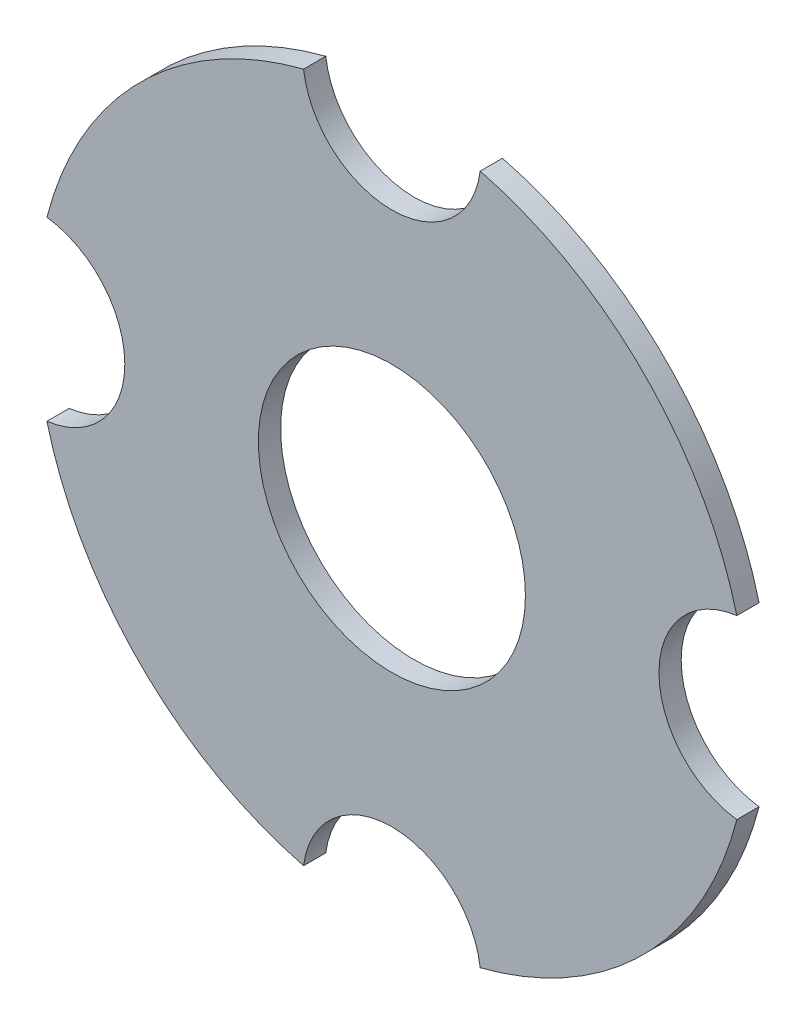
ISO-10303-21;
HEADER;
FILE_DESCRIPTION(('STEP AP214'),'2;1');
FILE_NAME('part.step','',(''),(''),'','','');
FILE_SCHEMA(('AUTOMOTIVE_DESIGN { 1 0 10303 214 1 1 1 1 }'));
ENDSEC;
DATA;
#1=APPLICATION_CONTEXT('core data for automotive mechanical design processes');
#2=APPLICATION_PROTOCOL_DEFINITION('international standard','automotive_design',2000,#1);
#3=PRODUCT_CONTEXT('',#1,'mechanical');
#4=PRODUCT('Part','Part','',(#3));
#5=PRODUCT_RELATED_PRODUCT_CATEGORY('part','',(#4));
#6=PRODUCT_DEFINITION_FORMATION('','',#4);
#7=PRODUCT_DEFINITION_CONTEXT('part definition',#1,'design');
#8=PRODUCT_DEFINITION('design','',#6,#7);
#9=PRODUCT_DEFINITION_SHAPE('','',#8);
#10=(LENGTH_UNIT() NAMED_UNIT(*) SI_UNIT(.MILLI.,.METRE.));
#11=(NAMED_UNIT(*) PLANE_ANGLE_UNIT() SI_UNIT($,.RADIAN.));
#12=(NAMED_UNIT(*) SI_UNIT($,.STERADIAN.) SOLID_ANGLE_UNIT());
#13=UNCERTAINTY_MEASURE_WITH_UNIT(LENGTH_MEASURE(1.E-05),#10,'distance_accuracy_value','');
#14=(GEOMETRIC_REPRESENTATION_CONTEXT(3) GLOBAL_UNCERTAINTY_ASSIGNED_CONTEXT((#13)) GLOBAL_UNIT_ASSIGNED_CONTEXT((#10,
#11,#12)) REPRESENTATION_CONTEXT('',''));
#15=CARTESIAN_POINT('',(0.,0.,0.));
#16=DIRECTION('',(0.,0.,1.));
#17=DIRECTION('',(1.,0.,0.));
#18=AXIS2_PLACEMENT_3D('',#15,#16,#17);
#19=CARTESIAN_POINT('',(0.,0.,3.175));
#20=DIRECTION('',(0.,0.,-1.));
#21=DIRECTION('',(-1.,0.,0.));
#22=AXIS2_PLACEMENT_3D('',#19,#20,#21);
#23=CYLINDRICAL_SURFACE('',#22,50.8);
#24=DIRECTION('',(0.,0.,-1.));
#25=VECTOR('',#24,1.);
#26=CARTESIAN_POINT('',(12.6003906189451,49.2125,1.5875));
#27=LINE('',#26,#25);
#28=CARTESIAN_POINT('',(12.6003906189451,49.2125,3.175));
#29=VERTEX_POINT('',#28);
#30=CARTESIAN_POINT('',(12.6003906189451,49.2125,0.));
#31=VERTEX_POINT('',#30);
#32=EDGE_CURVE('E130',#29,#31,#27,.T.);
#33=ORIENTED_EDGE('',*,*,#32,.F.);
#34=CARTESIAN_POINT('',(0.,0.,3.175));
#35=DIRECTION('',(0.,0.,1.));
#36=DIRECTION('',(1.,0.,0.));
#37=AXIS2_PLACEMENT_3D('',#34,#35,#36);
#38=CIRCLE('',#37,50.8);
#39=CARTESIAN_POINT('',(49.2125,12.6003906189451,3.175));
#40=VERTEX_POINT('',#39);
#41=EDGE_CURVE('E44',#40,#29,#38,.T.);
#42=ORIENTED_EDGE('',*,*,#41,.F.);
#43=DIRECTION('',(0.,0.,-1.));
#44=VECTOR('',#43,1.);
#45=CARTESIAN_POINT('',(49.2125,12.6003906189451,1.5875));
#46=LINE('',#45,#44);
#47=CARTESIAN_POINT('',(49.2125,12.6003906189451,0.));
#48=VERTEX_POINT('',#47);
#49=EDGE_CURVE('E149',#48,#40,#46,.F.);
#50=ORIENTED_EDGE('',*,*,#49,.F.);
#51=CARTESIAN_POINT('',(0.,0.,0.));
#52=DIRECTION('',(0.,0.,1.));
#53=DIRECTION('',(1.,0.,0.));
#54=AXIS2_PLACEMENT_3D('',#51,#52,#53);
#55=CIRCLE('',#54,50.8);
#56=EDGE_CURVE('E132',#48,#31,#55,.T.);
#57=ORIENTED_EDGE('',*,*,#56,.T.);
#58=EDGE_LOOP('',(#33,#42,#50,#57));
#59=FACE_BOUND('',#58,.T.);
#60=ADVANCED_FACE('F37',(#59),#23,.T.);
#61=DIRECTION('',(0.,0.,-1.));
#62=VECTOR('',#61,1.);
#63=CARTESIAN_POINT('',(-12.6003906189451,49.2125,1.5875));
#64=LINE('',#63,#62);
#65=CARTESIAN_POINT('',(-12.6003906189451,49.2125,0.));
#66=VERTEX_POINT('',#65);
#67=CARTESIAN_POINT('',(-12.6003906189451,49.2125,3.175));
#68=VERTEX_POINT('',#67);
#69=EDGE_CURVE('E146',#66,#68,#64,.F.);
#70=ORIENTED_EDGE('',*,*,#69,.F.);
#71=CARTESIAN_POINT('',(-49.2125,12.6003906189451,0.));
#72=VERTEX_POINT('',#71);
#73=EDGE_CURVE('E119',#66,#72,#55,.T.);
#74=ORIENTED_EDGE('',*,*,#73,.T.);
#75=DIRECTION('',(0.,0.,-1.));
#76=VECTOR('',#75,1.);
#77=CARTESIAN_POINT('',(-49.2125,12.6003906189451,1.5875));
#78=LINE('',#77,#76);
#79=CARTESIAN_POINT('',(-49.2125,12.6003906189451,3.175));
#80=VERTEX_POINT('',#79);
#81=EDGE_CURVE('E102',#80,#72,#78,.T.);
#82=ORIENTED_EDGE('',*,*,#81,.F.);
#83=EDGE_CURVE('E117',#68,#80,#38,.T.);
#84=ORIENTED_EDGE('',*,*,#83,.F.);
#85=EDGE_LOOP('',(#70,#74,#82,#84));
#86=FACE_BOUND('',#85,.T.);
#87=ADVANCED_FACE('F116',(#86),#23,.T.);
#88=DIRECTION('',(0.,0.,-1.));
#89=VECTOR('',#88,1.);
#90=CARTESIAN_POINT('',(49.2125,-12.6003906189451,1.5875));
#91=LINE('',#90,#89);
#92=CARTESIAN_POINT('',(49.2125,-12.6003906189451,3.175));
#93=VERTEX_POINT('',#92);
#94=CARTESIAN_POINT('',(49.2125,-12.6003906189451,0.));
#95=VERTEX_POINT('',#94);
#96=EDGE_CURVE('E51',#93,#95,#91,.T.);
#97=ORIENTED_EDGE('',*,*,#96,.F.);
#98=CARTESIAN_POINT('',(12.6003906189451,-49.2125,3.175));
#99=VERTEX_POINT('',#98);
#100=EDGE_CURVE('E128',#99,#93,#38,.T.);
#101=ORIENTED_EDGE('',*,*,#100,.F.);
#102=DIRECTION('',(0.,0.,-1.));
#103=VECTOR('',#102,1.);
#104=CARTESIAN_POINT('',(12.6003906189451,-49.2125,1.5875));
#105=LINE('',#104,#103);
#106=CARTESIAN_POINT('',(12.6003906189451,-49.2125,0.));
#107=VERTEX_POINT('',#106);
#108=EDGE_CURVE('E120',#107,#99,#105,.F.);
#109=ORIENTED_EDGE('',*,*,#108,.F.);
#110=EDGE_CURVE('E134',#107,#95,#55,.T.);
#111=ORIENTED_EDGE('',*,*,#110,.T.);
#112=EDGE_LOOP('',(#97,#101,#109,#111));
#113=FACE_BOUND('',#112,.T.);
#114=ADVANCED_FACE('F180',(#113),#23,.T.);
#115=DIRECTION('',(0.,0.,-1.));
#116=VECTOR('',#115,1.);
#117=CARTESIAN_POINT('',(-12.6003906189451,-49.2125,1.5875));
#118=LINE('',#117,#116);
#119=CARTESIAN_POINT('',(-12.6003906189451,-49.2125,3.175));
#120=VERTEX_POINT('',#119);
#121=CARTESIAN_POINT('',(-12.6003906189451,-49.2125,0.));
#122=VERTEX_POINT('',#121);
#123=EDGE_CURVE('E59',#120,#122,#118,.T.);
#124=ORIENTED_EDGE('',*,*,#123,.F.);
#125=CARTESIAN_POINT('',(-49.2125,-12.6003906189451,3.175));
#126=VERTEX_POINT('',#125);
#127=EDGE_CURVE('E126',#126,#120,#38,.T.);
#128=ORIENTED_EDGE('',*,*,#127,.F.);
#129=DIRECTION('',(0.,0.,-1.));
#130=VECTOR('',#129,1.);
#131=CARTESIAN_POINT('',(-49.2125,-12.6003906189451,1.5875));
#132=LINE('',#131,#130);
#133=CARTESIAN_POINT('',(-49.2125,-12.6003906189451,0.));
#134=VERTEX_POINT('',#133);
#135=EDGE_CURVE('E105',#134,#126,#132,.F.);
#136=ORIENTED_EDGE('',*,*,#135,.F.);
#137=EDGE_CURVE('E140',#134,#122,#55,.T.);
#138=ORIENTED_EDGE('',*,*,#137,.T.);
#139=EDGE_LOOP('',(#124,#128,#136,#138));
#140=FACE_BOUND('',#139,.T.);
#141=ADVANCED_FACE('F175',(#140),#23,.T.);
#142=CARTESIAN_POINT('',(0.,0.,3.175));
#143=DIRECTION('',(0.,0.,1.));
#144=DIRECTION('',(1.,0.,0.));
#145=AXIS2_PLACEMENT_3D('',#142,#143,#144);
#146=PLANE('',#145);
#147=CARTESIAN_POINT('',(0.,0.,3.175));
#148=DIRECTION('',(0.,0.,1.));
#149=DIRECTION('',(1.,0.,0.));
#150=AXIS2_PLACEMENT_3D('',#147,#148,#149);
#151=CIRCLE('',#150,19.05);
#152=CARTESIAN_POINT('',(19.05,0.,3.175));
#153=VERTEX_POINT('',#152);
#154=EDGE_CURVE('E156',#153,#153,#151,.T.);
#155=ORIENTED_EDGE('',*,*,#154,.F.);
#156=EDGE_LOOP('',(#155));
#157=FACE_BOUND('',#156,.T.);
#158=ORIENTED_EDGE('',*,*,#41,.T.);
#159=CARTESIAN_POINT('',(0.,50.8,3.175));
#160=DIRECTION('',(0.,0.,1.));
#161=DIRECTION('',(1.,0.,0.));
#162=AXIS2_PLACEMENT_3D('',#159,#160,#161);
#163=CIRCLE('',#162,12.7);
#164=EDGE_CURVE('E125',#68,#29,#163,.T.);
#165=ORIENTED_EDGE('',*,*,#164,.F.);
#166=ORIENTED_EDGE('',*,*,#83,.T.);
#167=CARTESIAN_POINT('',(-50.8,0.,3.175));
#168=DIRECTION('',(0.,0.,1.));
#169=DIRECTION('',(1.,0.,0.));
#170=AXIS2_PLACEMENT_3D('',#167,#168,#169);
#171=CIRCLE('',#170,12.7);
#172=EDGE_CURVE('E99',#126,#80,#171,.T.);
#173=ORIENTED_EDGE('',*,*,#172,.F.);
#174=ORIENTED_EDGE('',*,*,#127,.T.);
#175=CARTESIAN_POINT('',(0.,-50.8,3.175));
#176=DIRECTION('',(0.,0.,1.));
#177=DIRECTION('',(1.,0.,0.));
#178=AXIS2_PLACEMENT_3D('',#175,#176,#177);
#179=CIRCLE('',#178,12.7);
#180=EDGE_CURVE('E165',#99,#120,#179,.T.);
#181=ORIENTED_EDGE('',*,*,#180,.F.);
#182=ORIENTED_EDGE('',*,*,#100,.T.);
#183=CARTESIAN_POINT('',(50.8,0.,3.175));
#184=DIRECTION('',(0.,0.,1.));
#185=DIRECTION('',(1.,0.,0.));
#186=AXIS2_PLACEMENT_3D('',#183,#184,#185);
#187=CIRCLE('',#186,12.7);
#188=EDGE_CURVE('E164',#40,#93,#187,.T.);
#189=ORIENTED_EDGE('',*,*,#188,.F.);
#190=EDGE_LOOP('',(#158,#165,#166,#173,#174,#181,#182,#189));
#191=FACE_BOUND('',#190,.T.);
#192=ADVANCED_FACE('F124',(#157,#191),#146,.T.);
#193=CARTESIAN_POINT('',(0.,0.,0.));
#194=DIRECTION('',(0.,0.,1.));
#195=DIRECTION('',(1.,0.,0.));
#196=AXIS2_PLACEMENT_3D('',#193,#194,#195);
#197=PLANE('',#196);
#198=CARTESIAN_POINT('',(0.,50.8,0.));
#199=DIRECTION('',(0.,0.,1.));
#200=DIRECTION('',(1.,0.,0.));
#201=AXIS2_PLACEMENT_3D('',#198,#199,#200);
#202=CIRCLE('',#201,12.7);
#203=EDGE_CURVE('E167',#66,#31,#202,.T.);
#204=ORIENTED_EDGE('',*,*,#203,.T.);
#205=ORIENTED_EDGE('',*,*,#56,.F.);
#206=CARTESIAN_POINT('',(50.8,0.,0.));
#207=DIRECTION('',(0.,0.,1.));
#208=DIRECTION('',(1.,0.,0.));
#209=AXIS2_PLACEMENT_3D('',#206,#207,#208);
#210=CIRCLE('',#209,12.7);
#211=EDGE_CURVE('E162',#48,#95,#210,.T.);
#212=ORIENTED_EDGE('',*,*,#211,.T.);
#213=ORIENTED_EDGE('',*,*,#110,.F.);
#214=CARTESIAN_POINT('',(0.,-50.8,0.));
#215=DIRECTION('',(0.,0.,1.));
#216=DIRECTION('',(1.,0.,0.));
#217=AXIS2_PLACEMENT_3D('',#214,#215,#216);
#218=CIRCLE('',#217,12.7);
#219=EDGE_CURVE('E110',#107,#122,#218,.T.);
#220=ORIENTED_EDGE('',*,*,#219,.T.);
#221=ORIENTED_EDGE('',*,*,#137,.F.);
#222=CARTESIAN_POINT('',(-50.8,0.,0.));
#223=DIRECTION('',(0.,0.,1.));
#224=DIRECTION('',(1.,0.,0.));
#225=AXIS2_PLACEMENT_3D('',#222,#223,#224);
#226=CIRCLE('',#225,12.7);
#227=EDGE_CURVE('E11',#72,#134,#226,.F.);
#228=ORIENTED_EDGE('',*,*,#227,.F.);
#229=ORIENTED_EDGE('',*,*,#73,.F.);
#230=EDGE_LOOP('',(#204,#205,#212,#213,#220,#221,#228,#229));
#231=FACE_BOUND('',#230,.T.);
#232=CARTESIAN_POINT('',(0.,0.,0.));
#233=DIRECTION('',(0.,0.,1.));
#234=DIRECTION('',(1.,0.,0.));
#235=AXIS2_PLACEMENT_3D('',#232,#233,#234);
#236=CIRCLE('',#235,19.05);
#237=CARTESIAN_POINT('',(19.05,0.,0.));
#238=VERTEX_POINT('',#237);
#239=EDGE_CURVE('E157',#238,#238,#236,.T.);
#240=ORIENTED_EDGE('',*,*,#239,.T.);
#241=EDGE_LOOP('',(#240));
#242=FACE_BOUND('',#241,.T.);
#243=ADVANCED_FACE('F178',(#231,#242),#197,.F.);
#244=CARTESIAN_POINT('',(0.,0.,3.175));
#245=DIRECTION('',(0.,0.,-1.));
#246=DIRECTION('',(-1.,0.,0.));
#247=AXIS2_PLACEMENT_3D('',#244,#245,#246);
#248=CYLINDRICAL_SURFACE('',#247,19.05);
#249=ORIENTED_EDGE('',*,*,#154,.T.);
#250=EDGE_LOOP('',(#249));
#251=FACE_BOUND('',#250,.T.);
#252=ORIENTED_EDGE('',*,*,#239,.F.);
#253=EDGE_LOOP('',(#252));
#254=FACE_BOUND('',#253,.T.);
#255=ADVANCED_FACE('F218',(#251,#254),#248,.F.);
#256=CARTESIAN_POINT('',(-50.8,0.,3.175));
#257=DIRECTION('',(0.,0.,-1.));
#258=DIRECTION('',(-1.,0.,0.));
#259=AXIS2_PLACEMENT_3D('',#256,#257,#258);
#260=CYLINDRICAL_SURFACE('',#259,12.7);
#261=ORIENTED_EDGE('',*,*,#81,.T.);
#262=ORIENTED_EDGE('',*,*,#227,.T.);
#263=ORIENTED_EDGE('',*,*,#135,.T.);
#264=ORIENTED_EDGE('',*,*,#172,.T.);
#265=EDGE_LOOP('',(#261,#262,#263,#264));
#266=FACE_BOUND('',#265,.T.);
#267=ADVANCED_FACE('F101',(#266),#260,.F.);
#268=CARTESIAN_POINT('',(0.,-50.8,3.175));
#269=DIRECTION('',(0.,0.,-1.));
#270=DIRECTION('',(-1.,0.,0.));
#271=AXIS2_PLACEMENT_3D('',#268,#269,#270);
#272=CYLINDRICAL_SURFACE('',#271,12.7);
#273=ORIENTED_EDGE('',*,*,#123,.T.);
#274=ORIENTED_EDGE('',*,*,#219,.F.);
#275=ORIENTED_EDGE('',*,*,#108,.T.);
#276=ORIENTED_EDGE('',*,*,#180,.T.);
#277=EDGE_LOOP('',(#273,#274,#275,#276));
#278=FACE_BOUND('',#277,.T.);
#279=ADVANCED_FACE('F172',(#278),#272,.F.);
#280=CARTESIAN_POINT('',(50.8,0.,3.175));
#281=DIRECTION('',(0.,0.,-1.));
#282=DIRECTION('',(-1.,0.,0.));
#283=AXIS2_PLACEMENT_3D('',#280,#281,#282);
#284=CYLINDRICAL_SURFACE('',#283,12.7);
#285=ORIENTED_EDGE('',*,*,#96,.T.);
#286=ORIENTED_EDGE('',*,*,#211,.F.);
#287=ORIENTED_EDGE('',*,*,#49,.T.);
#288=ORIENTED_EDGE('',*,*,#188,.T.);
#289=EDGE_LOOP('',(#285,#286,#287,#288));
#290=FACE_BOUND('',#289,.T.);
#291=ADVANCED_FACE('F185',(#290),#284,.F.);
#292=CARTESIAN_POINT('',(0.,50.8,3.175));
#293=DIRECTION('',(0.,0.,-1.));
#294=DIRECTION('',(-1.,0.,0.));
#295=AXIS2_PLACEMENT_3D('',#292,#293,#294);
#296=CYLINDRICAL_SURFACE('',#295,12.7);
#297=ORIENTED_EDGE('',*,*,#32,.T.);
#298=ORIENTED_EDGE('',*,*,#203,.F.);
#299=ORIENTED_EDGE('',*,*,#69,.T.);
#300=ORIENTED_EDGE('',*,*,#164,.T.);
#301=EDGE_LOOP('',(#297,#298,#299,#300));
#302=FACE_BOUND('',#301,.T.);
#303=ADVANCED_FACE('F183',(#302),#296,.F.);
#304=CLOSED_SHELL('',(#60,#87,#114,#141,#192,#243,#255,#267,#279,#291,#303));
#305=MANIFOLD_SOLID_BREP('B2',#304);
#306=ADVANCED_BREP_SHAPE_REPRESENTATION('',(#18,#305),#14);
#307=SHAPE_DEFINITION_REPRESENTATION(#9,#306);
ENDSEC;
END-ISO-10303-21;
